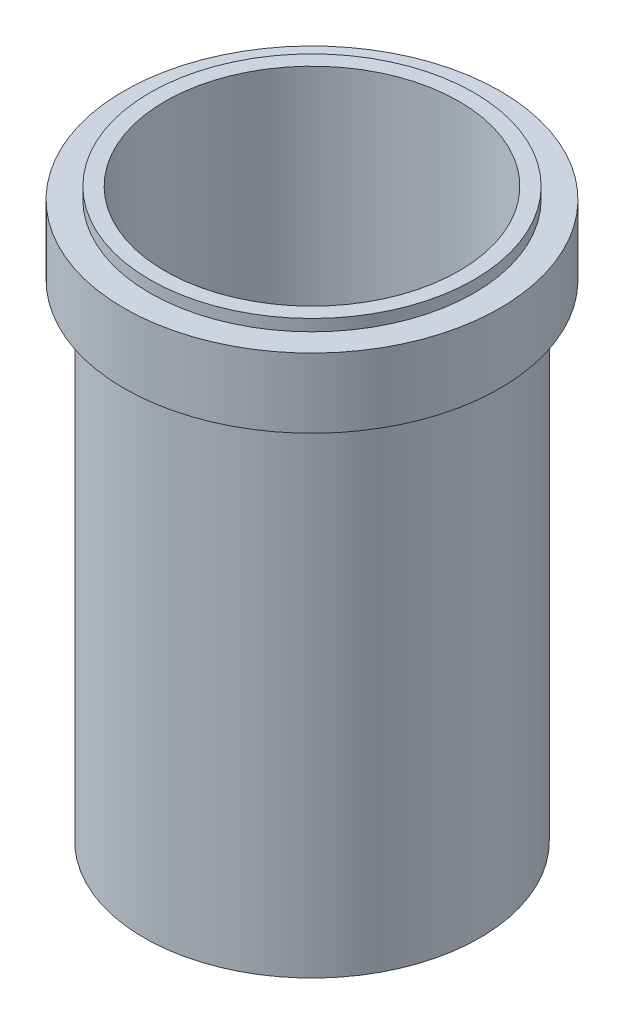
ISO-10303-21;
HEADER;
FILE_DESCRIPTION(('STEP AP214'),'2;1');
FILE_NAME('part.step','',(''),(''),'','','');
FILE_SCHEMA(('AUTOMOTIVE_DESIGN { 1 0 10303 214 1 1 1 1 }'));
ENDSEC;
DATA;
#1=APPLICATION_CONTEXT('core data for automotive mechanical design processes');
#2=APPLICATION_PROTOCOL_DEFINITION('international standard','automotive_design',2000,#1);
#3=PRODUCT_CONTEXT('',#1,'mechanical');
#4=PRODUCT('Part','Part','',(#3));
#5=PRODUCT_RELATED_PRODUCT_CATEGORY('part','',(#4));
#6=PRODUCT_DEFINITION_FORMATION('','',#4);
#7=PRODUCT_DEFINITION_CONTEXT('part definition',#1,'design');
#8=PRODUCT_DEFINITION('design','',#6,#7);
#9=PRODUCT_DEFINITION_SHAPE('','',#8);
#10=(LENGTH_UNIT() NAMED_UNIT(*) SI_UNIT(.MILLI.,.METRE.));
#11=(NAMED_UNIT(*) PLANE_ANGLE_UNIT() SI_UNIT($,.RADIAN.));
#12=(NAMED_UNIT(*) SI_UNIT($,.STERADIAN.) SOLID_ANGLE_UNIT());
#13=UNCERTAINTY_MEASURE_WITH_UNIT(LENGTH_MEASURE(1.E-05),#10,'distance_accuracy_value','');
#14=(GEOMETRIC_REPRESENTATION_CONTEXT(3) GLOBAL_UNCERTAINTY_ASSIGNED_CONTEXT((#13)) GLOBAL_UNIT_ASSIGNED_CONTEXT((#10,
#11,#12)) REPRESENTATION_CONTEXT('',''));
#15=CARTESIAN_POINT('',(0.,0.,0.));
#16=DIRECTION('',(0.,0.,1.));
#17=DIRECTION('',(1.,0.,0.));
#18=AXIS2_PLACEMENT_3D('',#15,#16,#17);
#19=CARTESIAN_POINT('',(29.,99.306213316111,0.));
#20=DIRECTION('',(0.,-1.,0.));
#21=DIRECTION('',(0.,0.,-1.));
#22=AXIS2_PLACEMENT_3D('',#19,#20,#21);
#23=PLANE('',#22);
#24=CARTESIAN_POINT('',(0.,99.306213316111,0.));
#25=DIRECTION('',(0.,-1.,0.));
#26=DIRECTION('',(0.,0.,-1.));
#27=AXIS2_PLACEMENT_3D('',#24,#25,#26);
#28=CIRCLE('',#27,32.5);
#29=CARTESIAN_POINT('',(0.,99.306213316111,-32.5));
#30=VERTEX_POINT('',#29);
#31=EDGE_CURVE('E10',#30,#30,#28,.T.);
#32=ORIENTED_EDGE('',*,*,#31,.T.);
#33=EDGE_LOOP('',(#32));
#34=FACE_BOUND('',#33,.T.);
#35=CARTESIAN_POINT('',(0.,99.306213316111,0.));
#36=DIRECTION('',(0.,-1.,0.));
#37=DIRECTION('',(0.,0.,-1.));
#38=AXIS2_PLACEMENT_3D('',#35,#36,#37);
#39=CIRCLE('',#38,29.);
#40=CARTESIAN_POINT('',(0.,99.306213316111,-29.));
#41=VERTEX_POINT('',#40);
#42=EDGE_CURVE('E63',#41,#41,#39,.T.);
#43=ORIENTED_EDGE('',*,*,#42,.F.);
#44=EDGE_LOOP('',(#43));
#45=FACE_BOUND('',#44,.T.);
#46=ADVANCED_FACE('F35',(#34,#45),#23,.T.);
#47=CARTESIAN_POINT('',(0.,0.,0.));
#48=DIRECTION('',(0.,-1.,0.));
#49=DIRECTION('',(0.,0.,-1.));
#50=AXIS2_PLACEMENT_3D('',#47,#48,#49);
#51=CYLINDRICAL_SURFACE('',#50,32.5);
#52=CARTESIAN_POINT('',(0.,111.306213316111,0.));
#53=DIRECTION('',(0.,-1.,0.));
#54=DIRECTION('',(0.,0.,-1.));
#55=AXIS2_PLACEMENT_3D('',#52,#53,#54);
#56=CIRCLE('',#55,32.5);
#57=CARTESIAN_POINT('',(0.,111.306213316111,-32.5));
#58=VERTEX_POINT('',#57);
#59=EDGE_CURVE('E41',#58,#58,#56,.T.);
#60=ORIENTED_EDGE('',*,*,#59,.T.);
#61=EDGE_LOOP('',(#60));
#62=FACE_BOUND('',#61,.T.);
#63=ORIENTED_EDGE('',*,*,#31,.F.);
#64=EDGE_LOOP('',(#63));
#65=FACE_BOUND('',#64,.T.);
#66=ADVANCED_FACE('F71',(#62,#65),#51,.T.);
#67=CARTESIAN_POINT('',(28.,111.306213316111,0.));
#68=DIRECTION('',(0.,1.,0.));
#69=DIRECTION('',(0.,0.,1.));
#70=AXIS2_PLACEMENT_3D('',#67,#68,#69);
#71=PLANE('',#70);
#72=CARTESIAN_POINT('',(0.,111.306213316111,0.));
#73=DIRECTION('',(0.,-1.,0.));
#74=DIRECTION('',(0.,0.,-1.));
#75=AXIS2_PLACEMENT_3D('',#72,#73,#74);
#76=CIRCLE('',#75,28.);
#77=CARTESIAN_POINT('',(0.,111.306213316111,-28.));
#78=VERTEX_POINT('',#77);
#79=EDGE_CURVE('E45',#78,#78,#76,.T.);
#80=ORIENTED_EDGE('',*,*,#79,.T.);
#81=EDGE_LOOP('',(#80));
#82=FACE_BOUND('',#81,.T.);
#83=ORIENTED_EDGE('',*,*,#59,.F.);
#84=EDGE_LOOP('',(#83));
#85=FACE_BOUND('',#84,.T.);
#86=ADVANCED_FACE('F75',(#82,#85),#71,.T.);
#87=CARTESIAN_POINT('',(0.,0.,0.));
#88=DIRECTION('',(0.,-1.,0.));
#89=DIRECTION('',(0.,0.,-1.));
#90=AXIS2_PLACEMENT_3D('',#87,#88,#89);
#91=CYLINDRICAL_SURFACE('',#90,28.);
#92=CARTESIAN_POINT('',(0.,113.306213316111,0.));
#93=DIRECTION('',(0.,-1.,0.));
#94=DIRECTION('',(0.,0.,-1.));
#95=AXIS2_PLACEMENT_3D('',#92,#93,#94);
#96=CIRCLE('',#95,28.);
#97=CARTESIAN_POINT('',(0.,113.306213316111,-28.));
#98=VERTEX_POINT('',#97);
#99=EDGE_CURVE('E49',#98,#98,#96,.T.);
#100=ORIENTED_EDGE('',*,*,#99,.T.);
#101=EDGE_LOOP('',(#100));
#102=FACE_BOUND('',#101,.T.);
#103=ORIENTED_EDGE('',*,*,#79,.F.);
#104=EDGE_LOOP('',(#103));
#105=FACE_BOUND('',#104,.T.);
#106=ADVANCED_FACE('F79',(#102,#105),#91,.T.);
#107=CARTESIAN_POINT('',(25.4,113.306213316111,0.));
#108=DIRECTION('',(0.,1.,0.));
#109=DIRECTION('',(0.,0.,1.));
#110=AXIS2_PLACEMENT_3D('',#107,#108,#109);
#111=PLANE('',#110);
#112=CARTESIAN_POINT('',(0.,113.306213316111,0.));
#113=DIRECTION('',(0.,-1.,0.));
#114=DIRECTION('',(0.,0.,-1.));
#115=AXIS2_PLACEMENT_3D('',#112,#113,#114);
#116=CIRCLE('',#115,25.4);
#117=CARTESIAN_POINT('',(0.,113.306213316111,-25.4));
#118=VERTEX_POINT('',#117);
#119=EDGE_CURVE('E54',#118,#118,#116,.T.);
#120=ORIENTED_EDGE('',*,*,#119,.T.);
#121=EDGE_LOOP('',(#120));
#122=FACE_BOUND('',#121,.T.);
#123=ORIENTED_EDGE('',*,*,#99,.F.);
#124=EDGE_LOOP('',(#123));
#125=FACE_BOUND('',#124,.T.);
#126=ADVANCED_FACE('F86',(#122,#125),#111,.T.);
#127=CARTESIAN_POINT('',(0.,0.,0.));
#128=DIRECTION('',(0.,-1.,0.));
#129=DIRECTION('',(0.,0.,-1.));
#130=AXIS2_PLACEMENT_3D('',#127,#128,#129);
#131=CYLINDRICAL_SURFACE('',#130,25.4);
#132=CARTESIAN_POINT('',(0.,15.306213316111,0.));
#133=DIRECTION('',(0.,-1.,0.));
#134=DIRECTION('',(0.,0.,-1.));
#135=AXIS2_PLACEMENT_3D('',#132,#133,#134);
#136=CIRCLE('',#135,25.4);
#137=CARTESIAN_POINT('',(0.,15.306213316111,-25.4));
#138=VERTEX_POINT('',#137);
#139=EDGE_CURVE('E57',#138,#138,#136,.T.);
#140=ORIENTED_EDGE('',*,*,#139,.T.);
#141=EDGE_LOOP('',(#140));
#142=FACE_BOUND('',#141,.T.);
#143=ORIENTED_EDGE('',*,*,#119,.F.);
#144=EDGE_LOOP('',(#143));
#145=FACE_BOUND('',#144,.T.);
#146=ADVANCED_FACE('F90',(#142,#145),#131,.F.);
#147=CARTESIAN_POINT('',(25.4,15.306213316111,0.));
#148=DIRECTION('',(0.,-1.,0.));
#149=DIRECTION('',(0.,0.,-1.));
#150=AXIS2_PLACEMENT_3D('',#147,#148,#149);
#151=PLANE('',#150);
#152=CARTESIAN_POINT('',(0.,15.306213316111,0.));
#153=DIRECTION('',(0.,-1.,0.));
#154=DIRECTION('',(0.,0.,-1.));
#155=AXIS2_PLACEMENT_3D('',#152,#153,#154);
#156=CIRCLE('',#155,29.);
#157=CARTESIAN_POINT('',(0.,15.306213316111,-29.));
#158=VERTEX_POINT('',#157);
#159=EDGE_CURVE('E60',#158,#158,#156,.T.);
#160=ORIENTED_EDGE('',*,*,#159,.T.);
#161=EDGE_LOOP('',(#160));
#162=FACE_BOUND('',#161,.T.);
#163=ORIENTED_EDGE('',*,*,#139,.F.);
#164=EDGE_LOOP('',(#163));
#165=FACE_BOUND('',#164,.T.);
#166=ADVANCED_FACE('F94',(#162,#165),#151,.T.);
#167=CARTESIAN_POINT('',(0.,0.,0.));
#168=DIRECTION('',(0.,-1.,0.));
#169=DIRECTION('',(0.,0.,-1.));
#170=AXIS2_PLACEMENT_3D('',#167,#168,#169);
#171=CYLINDRICAL_SURFACE('',#170,29.);
#172=ORIENTED_EDGE('',*,*,#42,.T.);
#173=EDGE_LOOP('',(#172));
#174=FACE_BOUND('',#173,.T.);
#175=ORIENTED_EDGE('',*,*,#159,.F.);
#176=EDGE_LOOP('',(#175));
#177=FACE_BOUND('',#176,.T.);
#178=ADVANCED_FACE('F67',(#174,#177),#171,.T.);
#179=CLOSED_SHELL('',(#46,#66,#86,#106,#126,#146,#166,#178));
#180=MANIFOLD_SOLID_BREP('B2',#179);
#181=ADVANCED_BREP_SHAPE_REPRESENTATION('',(#18,#180),#14);
#182=SHAPE_DEFINITION_REPRESENTATION(#9,#181);
ENDSEC;
END-ISO-10303-21;
